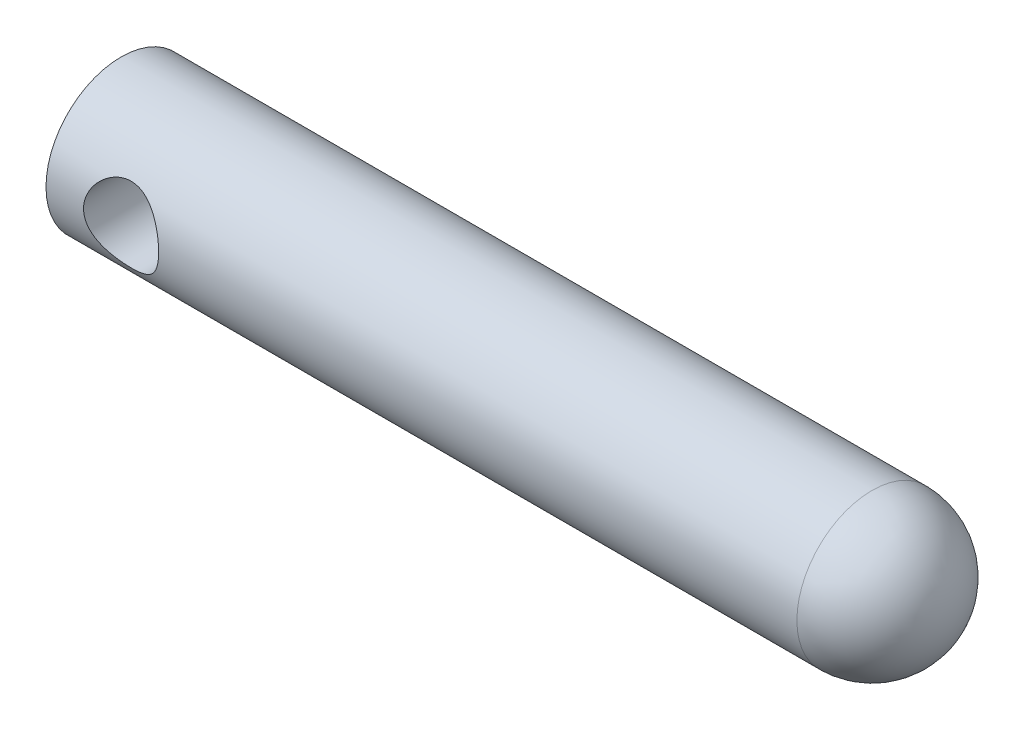
ISO-10303-21;
HEADER;
FILE_DESCRIPTION(('STEP AP214'),'2;1');
FILE_NAME('part.step','',(''),(''),'','','');
FILE_SCHEMA(('AUTOMOTIVE_DESIGN { 1 0 10303 214 1 1 1 1 }'));
ENDSEC;
DATA;
#1=APPLICATION_CONTEXT('core data for automotive mechanical design processes');
#2=APPLICATION_PROTOCOL_DEFINITION('international standard','automotive_design',2000,#1);
#3=PRODUCT_CONTEXT('',#1,'mechanical');
#4=PRODUCT('Part','Part','',(#3));
#5=PRODUCT_RELATED_PRODUCT_CATEGORY('part','',(#4));
#6=PRODUCT_DEFINITION_FORMATION('','',#4);
#7=PRODUCT_DEFINITION_CONTEXT('part definition',#1,'design');
#8=PRODUCT_DEFINITION('design','',#6,#7);
#9=PRODUCT_DEFINITION_SHAPE('','',#8);
#10=(LENGTH_UNIT() NAMED_UNIT(*) SI_UNIT(.MILLI.,.METRE.));
#11=(NAMED_UNIT(*) PLANE_ANGLE_UNIT() SI_UNIT($,.RADIAN.));
#12=(NAMED_UNIT(*) SI_UNIT($,.STERADIAN.) SOLID_ANGLE_UNIT());
#13=UNCERTAINTY_MEASURE_WITH_UNIT(LENGTH_MEASURE(1.E-05),#10,'distance_accuracy_value','');
#14=(GEOMETRIC_REPRESENTATION_CONTEXT(3) GLOBAL_UNCERTAINTY_ASSIGNED_CONTEXT((#13)) GLOBAL_UNIT_ASSIGNED_CONTEXT((#10,
#11,#12)) REPRESENTATION_CONTEXT('',''));
#15=CARTESIAN_POINT('',(0.,0.,0.));
#16=DIRECTION('',(0.,0.,1.));
#17=DIRECTION('',(1.,0.,0.));
#18=AXIS2_PLACEMENT_3D('',#15,#16,#17);
#19=CARTESIAN_POINT('',(22.,0.,0.));
#20=DIRECTION('',(-1.,0.,0.));
#21=DIRECTION('',(0.,0.,1.));
#22=AXIS2_PLACEMENT_3D('',#19,#20,#21);
#23=CYLINDRICAL_SURFACE('',#22,2.);
#24=CARTESIAN_POINT('',(20.,0.,0.));
#25=DIRECTION('',(-1.,0.,0.));
#26=DIRECTION('',(0.,0.,1.));
#27=AXIS2_PLACEMENT_3D('',#24,#25,#26);
#28=CIRCLE('',#27,2.);
#29=CARTESIAN_POINT('',(20.,0.,2.));
#30=VERTEX_POINT('',#29);
#31=EDGE_CURVE('E10',#30,#30,#28,.T.);
#32=ORIENTED_EDGE('',*,*,#31,.T.);
#33=EDGE_LOOP('',(#32));
#34=FACE_BOUND('',#33,.T.);
#35=CARTESIAN_POINT('',(3.,0.,-2.));
#36=CARTESIAN_POINT('',(2.9999966976805,0.0525719629529865,-1.99999713404151));
#37=CARTESIAN_POINT('',(2.99582992687833,0.105206599698033,-1.99790491019518));
#38=CARTESIAN_POINT('',(2.97934711965908,0.208920235268425,-1.98974156037396));
#39=CARTESIAN_POINT('',(2.96701560700235,0.259996086713504,-1.98366287828984));
#40=CARTESIAN_POINT('',(2.93480619138321,0.358933544880574,-1.96816279403312));
#41=CARTESIAN_POINT('',(2.91495761575199,0.40680680293918,-1.9587543917752));
#42=CARTESIAN_POINT('',(2.86842937863506,0.498472616806565,-1.93745776515779));
#43=CARTESIAN_POINT('',(2.84175025575115,0.54226549399005,-1.9255697363353));
#44=CARTESIAN_POINT('',(2.7804827505147,0.627507817761919,-1.89956258258057));
#45=CARTESIAN_POINT('',(2.74551352076036,0.668655211122112,-1.88535199127536));
#46=CARTESIAN_POINT('',(2.66947852075297,0.744779444866977,-1.85659970246744));
#47=CARTESIAN_POINT('',(2.62840814822756,0.779751583106767,-1.84205776209035));
#48=CARTESIAN_POINT('',(2.53751665047662,0.845252000450279,-1.81298951197347));
#49=CARTESIAN_POINT('',(2.48726390165409,0.875225335551638,-1.79855186970132));
#50=CARTESIAN_POINT('',(2.38163266401378,0.926168226890696,-1.77285978772321));
#51=CARTESIAN_POINT('',(2.32625787127725,0.947144214966334,-1.7616030760699));
#52=CARTESIAN_POINT('',(2.21533489457808,0.978132442188589,-1.74457867037809));
#53=CARTESIAN_POINT('',(2.15999554793261,0.988725857080441,-1.73852271583714));
#54=CARTESIAN_POINT('',(2.04802116222052,1.00042699330885,-1.73181889948528));
#55=CARTESIAN_POINT('',(1.99138745912885,1.00154408837307,-1.73116569343288));
#56=CARTESIAN_POINT('',(1.88571397568463,0.994687287172295,-1.73510930257249));
#57=CARTESIAN_POINT('',(1.83657596877695,0.987784559536822,-1.73908763662014));
#58=CARTESIAN_POINT('',(1.74027809062696,0.966939849056932,-1.7507622873385));
#59=CARTESIAN_POINT('',(1.69311885469468,0.952995623897652,-1.75845978831776));
#60=CARTESIAN_POINT('',(1.60077086743434,0.918209780386004,-1.77687476412741));
#61=CARTESIAN_POINT('',(1.55565360121421,0.897215067115995,-1.78765840663999));
#62=CARTESIAN_POINT('',(1.46936570740999,0.849041687668003,-1.81103404281404));
#63=CARTESIAN_POINT('',(1.42819686439991,0.821860243812468,-1.82362684780191));
#64=CARTESIAN_POINT('',(1.34547874725677,0.758066054912789,-1.85113157903286));
#65=CARTESIAN_POINT('',(1.30454312642384,0.720694458369282,-1.86613510236746));
#66=CARTESIAN_POINT('',(1.2292645814091,0.639555578741374,-1.89547623300407));
#67=CARTESIAN_POINT('',(1.19492480796612,0.595785256574285,-1.90981351958801));
#68=CARTESIAN_POINT('',(1.13231433897027,0.500516505831848,-1.93701987282964));
#69=CARTESIAN_POINT('',(1.10439952755426,0.448753591599409,-1.94978984162008));
#70=CARTESIAN_POINT('',(1.05790297095699,0.340466215488797,-1.97157881121242));
#71=CARTESIAN_POINT('',(1.03931381498483,0.283945576265276,-1.98060078943553));
#72=CARTESIAN_POINT('',(1.01352459628332,0.172766491660702,-1.99324333741436));
#73=CARTESIAN_POINT('',(1.00550876425322,0.118341530548324,-1.99724938301312));
#74=CARTESIAN_POINT('',(0.99853526886551,0.00877959994935363,-2.00073013459102));
#75=CARTESIAN_POINT('',(0.999573314360521,-0.0463570198699014,-2.00020698721312));
#76=CARTESIAN_POINT('',(1.01020668841875,-0.151232971985994,-1.99491192253441));
#77=CARTESIAN_POINT('',(1.01913253273003,-0.201059408049954,-1.9904724568819));
#78=CARTESIAN_POINT('',(1.04423807189509,-0.298406892301917,-1.97822171314819));
#79=CARTESIAN_POINT('',(1.06041856645336,-0.345927685690997,-1.97041006334333));
#80=CARTESIAN_POINT('',(1.09999846643317,-0.438888608449665,-1.9518425141367));
#81=CARTESIAN_POINT('',(1.12359105011681,-0.484230397006154,-1.94100881769939));
#82=CARTESIAN_POINT('',(1.17710753564604,-0.570461361698921,-1.91743974317109));
#83=CARTESIAN_POINT('',(1.20703413459343,-0.611348629775282,-1.90470355565785));
#84=CARTESIAN_POINT('',(1.27576042533287,-0.691767689290653,-1.87708221337465));
#85=CARTESIAN_POINT('',(1.31514286845356,-0.730772077824639,-1.86210884848441));
#86=CARTESIAN_POINT('',(1.3999251512693,-0.80185632111324,-1.83262391603875));
#87=CARTESIAN_POINT('',(1.44532911881637,-0.833931385690841,-1.81811267381527));
#88=CARTESIAN_POINT('',(1.54364365420031,-0.891707914497696,-1.79051192226068));
#89=CARTESIAN_POINT('',(1.59681126620859,-0.917025495878638,-1.77752529663472));
#90=CARTESIAN_POINT('',(1.70751006769252,-0.958082826013803,-1.75574072368126));
#91=CARTESIAN_POINT('',(1.76503552650119,-0.97383491588757,-1.74693738240618));
#92=CARTESIAN_POINT('',(1.87691022286145,-0.993861687449679,-1.73561501008667));
#93=CARTESIAN_POINT('',(1.93103425342904,-0.999092996400865,-1.73257383460491));
#94=CARTESIAN_POINT('',(2.03944706717073,-1.00068915438079,-1.73165354646175));
#95=CARTESIAN_POINT('',(2.09373576873943,-0.997057846624399,-1.73377219627553));
#96=CARTESIAN_POINT('',(2.19548350153202,-0.981926125592263,-1.74237862050025));
#97=CARTESIAN_POINT('',(2.2431004701444,-0.971208314342799,-1.74843094482394));
#98=CARTESIAN_POINT('',(2.33580811942471,-0.943175358224645,-1.76371016187918));
#99=CARTESIAN_POINT('',(2.38089798209197,-0.92585809115981,-1.77293807569676));
#100=CARTESIAN_POINT('',(2.47062485098661,-0.883815745300683,-1.79428530364528));
#101=CARTESIAN_POINT('',(2.5150279018297,-0.858671137816458,-1.80655722396191));
#102=CARTESIAN_POINT('',(2.59927453618059,-0.802150971636634,-1.8323533163459));
#103=CARTESIAN_POINT('',(2.63911573051849,-0.770772171238648,-1.84587813794522));
#104=CARTESIAN_POINT('',(2.71814198235762,-0.698203326664641,-1.87462323159313));
#105=CARTESIAN_POINT('',(2.75665910236192,-0.656284423010171,-1.88984983311469));
#106=CARTESIAN_POINT('',(2.82626298342363,-0.56615480622028,-1.91877752255088));
#107=CARTESIAN_POINT('',(2.85734573942629,-0.517940723256785,-1.9324777860804));
#108=CARTESIAN_POINT('',(2.9112363627622,-0.415931596819947,-1.95698009585103));
#109=CARTESIAN_POINT('',(2.93398416941143,-0.362099503934614,-1.96776096562909));
#110=CARTESIAN_POINT('',(2.96980816791895,-0.250742101294191,-1.98501341363466));
#111=CARTESIAN_POINT('',(2.98291184682958,-0.193227799623166,-1.99149723372932));
#112=CARTESIAN_POINT('',(2.99389741107585,-0.112601946483384,-1.99695461909663));
#113=CARTESIAN_POINT('',(2.99618264086362,-0.0901618794394987,-1.99809365339202));
#114=CARTESIAN_POINT('',(2.99923466551681,-0.0451517318071577,-1.99961696977865));
#115=CARTESIAN_POINT('',(3.0000014184712,-0.0225816476473814,-2.00000123103763));
#116=CARTESIAN_POINT('',(3.,0.,-2.));
#117=B_SPLINE_CURVE_WITH_KNOTS('',3,(#35,#36,#37,#38,#39,#40,#41,#42,#43,#44,#45,#46,#47,#48,
#49,#50,#51,#52,#53,#54,#55,#56,#57,#58,#59,#60,#61,#62,#63,#64,#65,#66,#67,#68,#69,#70,#71,#72,
#73,#74,#75,#76,#77,#78,#79,#80,#81,#82,#83,#84,#85,#86,#87,#88,#89,#90,#91,#92,#93,#94,#95,#96,
#97,#98,#99,#100,#101,#102,#103,#104,#105,#106,#107,#108,#109,#110,#111,#112,#113,#114,#115,
#116),.UNSPECIFIED.,.T.,.F.,(4,2,2,2,2,2,2,2,2,2,2,2,2,2,2,2,2,2,2,2,2,2,2,2,2,2,2,2,2,2,2,2,2,
2,2,2,2,2,2,2,4),(0.,0.157624257420293,0.315548149709198,0.472862155492298,0.630163760581568,
0.796981758718089,0.963926237654036,1.14381726430753,1.32357947898281,1.4925801214023,
1.6614135732902,1.81005712409321,1.95874803925678,2.11090240168487,2.26312521260222,
2.43464941333878,2.60625534598686,2.78583022214441,2.9652621691228,3.12983290471346,
3.29432564511476,3.44606906506122,3.59782921630932,3.75392856027899,3.91009450748339,
4.08159610644419,4.25321588615432,4.43314682159674,4.61284511940778,4.77529307498373,
4.93767059860005,5.08457930244183,5.23153528783678,5.38836456775614,5.54527561138958,
5.72125242752498,5.89732383376573,6.07464013662925,6.2514490862493,6.31915280137698,
6.38685838514847),.UNSPECIFIED.);
#118=CARTESIAN_POINT('',(3.,0.,-2.));
#119=VERTEX_POINT('',#118);
#120=EDGE_CURVE('E45',#119,#119,#117,.T.);
#121=ORIENTED_EDGE('',*,*,#120,.T.);
#122=EDGE_LOOP('',(#121));
#123=FACE_BOUND('',#122,.T.);
#124=CARTESIAN_POINT('',(3.,0.,2.));
#125=CARTESIAN_POINT('',(2.9999966976805,-0.0525719629529866,1.99999713404151));
#126=CARTESIAN_POINT('',(2.99582992687833,-0.105206599698033,1.99790491019518));
#127=CARTESIAN_POINT('',(2.97934711965908,-0.208920235268425,1.98974156037396));
#128=CARTESIAN_POINT('',(2.96701560700235,-0.259996086713504,1.98366287828984));
#129=CARTESIAN_POINT('',(2.93480619138321,-0.358933544880574,1.96816279403312));
#130=CARTESIAN_POINT('',(2.91495761575199,-0.40680680293918,1.9587543917752));
#131=CARTESIAN_POINT('',(2.86842937863506,-0.498472616806565,1.93745776515779));
#132=CARTESIAN_POINT('',(2.84175025575115,-0.54226549399005,1.9255697363353));
#133=CARTESIAN_POINT('',(2.7804827505147,-0.627507817761919,1.89956258258057));
#134=CARTESIAN_POINT('',(2.74551352076036,-0.668655211122112,1.88535199127536));
#135=CARTESIAN_POINT('',(2.66947852075297,-0.744779444866977,1.85659970246744));
#136=CARTESIAN_POINT('',(2.62840814822756,-0.779751583106767,1.84205776209035));
#137=CARTESIAN_POINT('',(2.53751665047662,-0.845252000450279,1.81298951197347));
#138=CARTESIAN_POINT('',(2.48726390165409,-0.875225335551638,1.79855186970132));
#139=CARTESIAN_POINT('',(2.38163266401379,-0.926168226890696,1.77285978772321));
#140=CARTESIAN_POINT('',(2.32625787127725,-0.947144214966334,1.7616030760699));
#141=CARTESIAN_POINT('',(2.21533489457808,-0.978132442188589,1.74457867037809));
#142=CARTESIAN_POINT('',(2.15999554793261,-0.988725857080441,1.73852271583714));
#143=CARTESIAN_POINT('',(2.04802116222052,-1.00042699330885,1.73181889948528));
#144=CARTESIAN_POINT('',(1.99138745912885,-1.00154408837307,1.73116569343288));
#145=CARTESIAN_POINT('',(1.88571397568463,-0.994687287172295,1.73510930257249));
#146=CARTESIAN_POINT('',(1.83657596877695,-0.987784559536822,1.73908763662014));
#147=CARTESIAN_POINT('',(1.74027809062696,-0.966939849056932,1.7507622873385));
#148=CARTESIAN_POINT('',(1.69311885469468,-0.952995623897652,1.75845978831776));
#149=CARTESIAN_POINT('',(1.60077086743434,-0.918209780386004,1.77687476412741));
#150=CARTESIAN_POINT('',(1.55565360121421,-0.897215067115995,1.78765840663999));
#151=CARTESIAN_POINT('',(1.46936570740999,-0.849041687668003,1.81103404281404));
#152=CARTESIAN_POINT('',(1.42819686439991,-0.821860243812468,1.82362684780191));
#153=CARTESIAN_POINT('',(1.34547874725677,-0.758066054912789,1.85113157903286));
#154=CARTESIAN_POINT('',(1.30454312642384,-0.720694458369282,1.86613510236746));
#155=CARTESIAN_POINT('',(1.2292645814091,-0.639555578741373,1.89547623300407));
#156=CARTESIAN_POINT('',(1.19492480796612,-0.595785256574285,1.90981351958801));
#157=CARTESIAN_POINT('',(1.13231433897027,-0.500516505831848,1.93701987282964));
#158=CARTESIAN_POINT('',(1.10439952755426,-0.448753591599409,1.94978984162008));
#159=CARTESIAN_POINT('',(1.05790297095699,-0.340466215488797,1.97157881121242));
#160=CARTESIAN_POINT('',(1.03931381498483,-0.283945576265276,1.98060078943553));
#161=CARTESIAN_POINT('',(1.01352459628332,-0.172766491660702,1.99324333741436));
#162=CARTESIAN_POINT('',(1.00550876425322,-0.118341530548324,1.99724938301312));
#163=CARTESIAN_POINT('',(0.99853526886551,-0.00877959994935378,2.00073013459102));
#164=CARTESIAN_POINT('',(0.999573314360521,0.0463570198699013,2.00020698721312));
#165=CARTESIAN_POINT('',(1.01020668841875,0.151232971985994,1.99491192253441));
#166=CARTESIAN_POINT('',(1.01913253273003,0.201059408049954,1.9904724568819));
#167=CARTESIAN_POINT('',(1.04423807189509,0.298406892301917,1.97822171314819));
#168=CARTESIAN_POINT('',(1.06041856645336,0.345927685690997,1.97041006334333));
#169=CARTESIAN_POINT('',(1.09999846643317,0.438888608449665,1.9518425141367));
#170=CARTESIAN_POINT('',(1.12359105011681,0.484230397006154,1.94100881769939));
#171=CARTESIAN_POINT('',(1.17710753564604,0.570461361698921,1.91743974317109));
#172=CARTESIAN_POINT('',(1.20703413459343,0.611348629775282,1.90470355565785));
#173=CARTESIAN_POINT('',(1.27576042533287,0.691767689290653,1.87708221337465));
#174=CARTESIAN_POINT('',(1.31514286845356,0.730772077824639,1.86210884848441));
#175=CARTESIAN_POINT('',(1.3999251512693,0.80185632111324,1.83262391603875));
#176=CARTESIAN_POINT('',(1.44532911881637,0.833931385690841,1.81811267381527));
#177=CARTESIAN_POINT('',(1.54364365420031,0.891707914497696,1.79051192226068));
#178=CARTESIAN_POINT('',(1.59681126620859,0.917025495878638,1.77752529663472));
#179=CARTESIAN_POINT('',(1.70751006769252,0.958082826013803,1.75574072368126));
#180=CARTESIAN_POINT('',(1.76503552650119,0.97383491588757,1.74693738240618));
#181=CARTESIAN_POINT('',(1.87691022286145,0.993861687449679,1.73561501008667));
#182=CARTESIAN_POINT('',(1.93103425342904,0.999092996400865,1.73257383460491));
#183=CARTESIAN_POINT('',(2.03944706717073,1.00068915438079,1.73165354646175));
#184=CARTESIAN_POINT('',(2.09373576873943,0.997057846624399,1.73377219627553));
#185=CARTESIAN_POINT('',(2.19548350153202,0.981926125592263,1.74237862050025));
#186=CARTESIAN_POINT('',(2.2431004701444,0.971208314342799,1.74843094482394));
#187=CARTESIAN_POINT('',(2.33580811942471,0.943175358224645,1.76371016187918));
#188=CARTESIAN_POINT('',(2.38089798209197,0.92585809115981,1.77293807569676));
#189=CARTESIAN_POINT('',(2.47062485098661,0.883815745300683,1.79428530364528));
#190=CARTESIAN_POINT('',(2.5150279018297,0.858671137816458,1.80655722396191));
#191=CARTESIAN_POINT('',(2.59927453618059,0.802150971636634,1.8323533163459));
#192=CARTESIAN_POINT('',(2.63911573051849,0.770772171238648,1.84587813794522));
#193=CARTESIAN_POINT('',(2.71814198235762,0.698203326664641,1.87462323159313));
#194=CARTESIAN_POINT('',(2.75665910236192,0.656284423010171,1.88984983311469));
#195=CARTESIAN_POINT('',(2.82626298342363,0.56615480622028,1.91877752255088));
#196=CARTESIAN_POINT('',(2.85734573942629,0.517940723256785,1.9324777860804));
#197=CARTESIAN_POINT('',(2.9112363627622,0.415931596819947,1.95698009585103));
#198=CARTESIAN_POINT('',(2.93398416941143,0.362099503934614,1.96776096562909));
#199=CARTESIAN_POINT('',(2.96980816791895,0.250742101294191,1.98501341363466));
#200=CARTESIAN_POINT('',(2.98291184682958,0.193227799623166,1.99149723372932));
#201=CARTESIAN_POINT('',(2.99389741107585,0.112601946483384,1.99695461909663));
#202=CARTESIAN_POINT('',(2.99618264086362,0.0901618794394987,1.99809365339202));
#203=CARTESIAN_POINT('',(2.99923466551681,0.0451517318071577,1.99961696977865));
#204=CARTESIAN_POINT('',(3.0000014184712,0.0225816476473814,2.00000123103763));
#205=CARTESIAN_POINT('',(3.,0.,2.));
#206=B_SPLINE_CURVE_WITH_KNOTS('',3,(#124,#125,#126,#127,#128,#129,#130,#131,#132,#133,#134,
#135,#136,#137,#138,#139,#140,#141,#142,#143,#144,#145,#146,#147,#148,#149,#150,#151,#152,#153,
#154,#155,#156,#157,#158,#159,#160,#161,#162,#163,#164,#165,#166,#167,#168,#169,#170,#171,#172,
#173,#174,#175,#176,#177,#178,#179,#180,#181,#182,#183,#184,#185,#186,#187,#188,#189,#190,#191,
#192,#193,#194,#195,#196,#197,#198,#199,#200,#201,#202,#203,#204,#205),.UNSPECIFIED.,.T.,.F.,(4,
2,2,2,2,2,2,2,2,2,2,2,2,2,2,2,2,2,2,2,2,2,2,2,2,2,2,2,2,2,2,2,2,2,2,2,2,2,2,2,4),(0.,
0.157624257420293,0.315548149709198,0.472862155492298,0.630163760581568,0.796981758718089,
0.963926237654035,1.14381726430753,1.32357947898281,1.4925801214023,1.6614135732902,
1.81005712409321,1.95874803925678,2.11090240168487,2.26312521260222,2.43464941333878,
2.60625534598686,2.78583022214441,2.9652621691228,3.12983290471346,3.29432564511476,
3.44606906506122,3.59782921630932,3.75392856027899,3.91009450748339,4.08159610644419,
4.25321588615432,4.43314682159674,4.61284511940778,4.77529307498373,4.93767059860005,
5.08457930244183,5.23153528783678,5.38836456775614,5.54527561138958,5.72125242752498,
5.89732383376573,6.07464013662925,6.2514490862493,6.31915280137698,6.38685838514847),.UNSPECIFIED.);
#207=CARTESIAN_POINT('',(3.,0.,2.));
#208=VERTEX_POINT('',#207);
#209=EDGE_CURVE('E50',#208,#208,#206,.T.);
#210=ORIENTED_EDGE('',*,*,#209,.T.);
#211=EDGE_LOOP('',(#210));
#212=FACE_BOUND('',#211,.T.);
#213=CARTESIAN_POINT('',(0.,0.,0.));
#214=DIRECTION('',(1.,0.,0.));
#215=DIRECTION('',(0.,0.,-1.));
#216=AXIS2_PLACEMENT_3D('',#213,#214,#215);
#217=CIRCLE('',#216,2.);
#218=CARTESIAN_POINT('',(0.,0.,-2.));
#219=VERTEX_POINT('',#218);
#220=EDGE_CURVE('E55',#219,#219,#217,.T.);
#221=ORIENTED_EDGE('',*,*,#220,.T.);
#222=EDGE_LOOP('',(#221));
#223=FACE_BOUND('',#222,.T.);
#224=ADVANCED_FACE('F37',(#34,#123,#212,#223),#23,.T.);
#225=CARTESIAN_POINT('',(0.,0.,0.));
#226=DIRECTION('',(1.,0.,0.));
#227=DIRECTION('',(0.,0.,-1.));
#228=AXIS2_PLACEMENT_3D('',#225,#226,#227);
#229=PLANE('',#228);
#230=ORIENTED_EDGE('',*,*,#220,.F.);
#231=EDGE_LOOP('',(#230));
#232=FACE_BOUND('',#231,.T.);
#233=ADVANCED_FACE('F70',(#232),#229,.F.);
#234=CARTESIAN_POINT('',(2.,0.,-2.));
#235=DIRECTION('',(0.,0.,1.));
#236=DIRECTION('',(1.,0.,0.));
#237=AXIS2_PLACEMENT_3D('',#234,#235,#236);
#238=CYLINDRICAL_SURFACE('',#237,1.);
#239=ORIENTED_EDGE('',*,*,#209,.F.);
#240=EDGE_LOOP('',(#239));
#241=FACE_BOUND('',#240,.T.);
#242=ORIENTED_EDGE('',*,*,#120,.F.);
#243=EDGE_LOOP('',(#242));
#244=FACE_BOUND('',#243,.T.);
#245=ADVANCED_FACE('F67',(#241,#244),#238,.F.);
#246=CARTESIAN_POINT('',(20.,0.,0.));
#247=DIRECTION('',(1.,0.,0.));
#248=DIRECTION('',(0.,0.,-1.));
#249=AXIS2_PLACEMENT_3D('',#246,#247,#248);
#250=SPHERICAL_SURFACE('',#249,2.);
#251=ORIENTED_EDGE('',*,*,#31,.F.);
#252=EDGE_LOOP('',(#251));
#253=FACE_BOUND('',#252,.T.);
#254=ADVANCED_FACE('F39',(#253),#250,.T.);
#255=CLOSED_SHELL('',(#224,#233,#245,#254));
#256=MANIFOLD_SOLID_BREP('B2',#255);
#257=ADVANCED_BREP_SHAPE_REPRESENTATION('',(#18,#256),#14);
#258=SHAPE_DEFINITION_REPRESENTATION(#9,#257);
ENDSEC;
END-ISO-10303-21;
